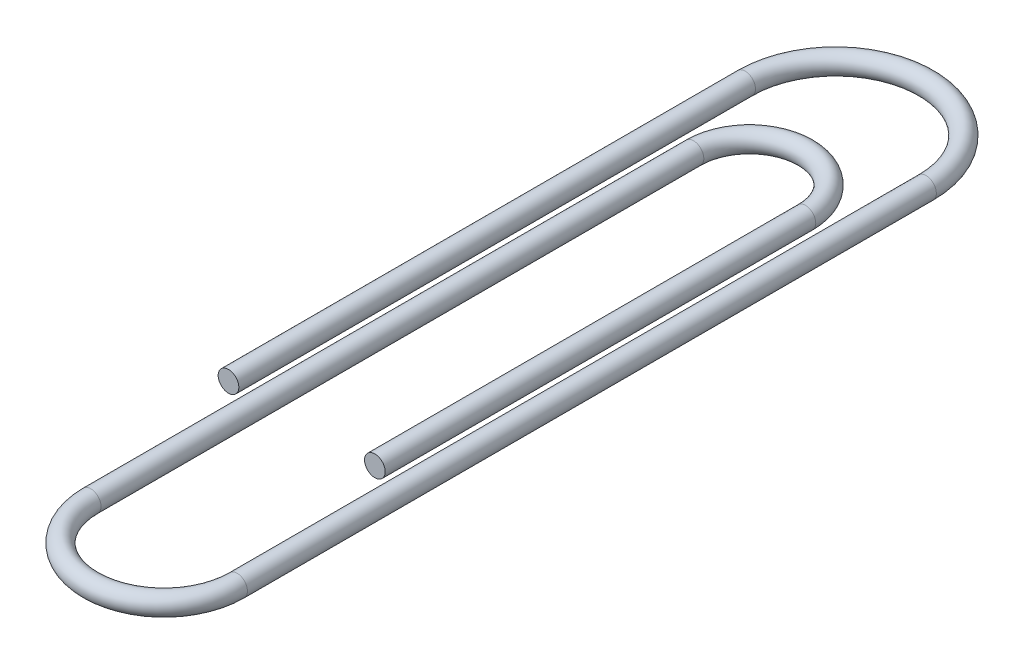
ISO-10303-21;
HEADER;
FILE_DESCRIPTION(('STEP AP214'),'2;1');
FILE_NAME('part.step','',(''),(''),'','','');
FILE_SCHEMA(('AUTOMOTIVE_DESIGN { 1 0 10303 214 1 1 1 1 }'));
ENDSEC;
DATA;
#1=APPLICATION_CONTEXT('core data for automotive mechanical design processes');
#2=APPLICATION_PROTOCOL_DEFINITION('international standard','automotive_design',2000,#1);
#3=PRODUCT_CONTEXT('',#1,'mechanical');
#4=PRODUCT('Part','Part','',(#3));
#5=PRODUCT_RELATED_PRODUCT_CATEGORY('part','',(#4));
#6=PRODUCT_DEFINITION_FORMATION('','',#4);
#7=PRODUCT_DEFINITION_CONTEXT('part definition',#1,'design');
#8=PRODUCT_DEFINITION('design','',#6,#7);
#9=PRODUCT_DEFINITION_SHAPE('','',#8);
#10=(LENGTH_UNIT() NAMED_UNIT(*) SI_UNIT(.MILLI.,.METRE.));
#11=(NAMED_UNIT(*) PLANE_ANGLE_UNIT() SI_UNIT($,.RADIAN.));
#12=(NAMED_UNIT(*) SI_UNIT($,.STERADIAN.) SOLID_ANGLE_UNIT());
#13=UNCERTAINTY_MEASURE_WITH_UNIT(LENGTH_MEASURE(1.E-05),#10,'distance_accuracy_value','');
#14=(GEOMETRIC_REPRESENTATION_CONTEXT(3) GLOBAL_UNCERTAINTY_ASSIGNED_CONTEXT((#13)) GLOBAL_UNIT_ASSIGNED_CONTEXT((#10,
#11,#12)) REPRESENTATION_CONTEXT('',''));
#15=CARTESIAN_POINT('',(0.,0.,0.));
#16=DIRECTION('',(0.,0.,1.));
#17=DIRECTION('',(1.,0.,0.));
#18=AXIS2_PLACEMENT_3D('',#15,#16,#17);
#19=CARTESIAN_POINT('',(0.,0.,0.));
#20=DIRECTION('',(0.,0.,1.));
#21=DIRECTION('',(1.,0.,0.));
#22=AXIS2_PLACEMENT_3D('',#19,#20,#21);
#23=PLANE('',#22);
#24=CARTESIAN_POINT('',(0.,0.,0.));
#25=DIRECTION('',(0.,0.,1.));
#26=DIRECTION('',(1.,0.,0.));
#27=AXIS2_PLACEMENT_3D('',#24,#25,#26);
#28=CIRCLE('',#27,0.6);
#29=CARTESIAN_POINT('',(0.6,0.,0.));
#30=VERTEX_POINT('',#29);
#31=EDGE_CURVE('E81',#30,#30,#28,.T.);
#32=ORIENTED_EDGE('',*,*,#31,.T.);
#33=EDGE_LOOP('',(#32));
#34=FACE_BOUND('',#33,.T.);
#35=ADVANCED_FACE('F53',(#34),#23,.T.);
#36=CARTESIAN_POINT('',(-8.49999999999999,0.,0.));
#37=DIRECTION('',(0.,0.,-1.));
#38=DIRECTION('',(-1.,0.,0.));
#39=AXIS2_PLACEMENT_3D('',#36,#37,#38);
#40=PLANE('',#39);
#41=CARTESIAN_POINT('',(-8.49999999999999,0.,0.));
#42=DIRECTION('',(0.,0.,-1.));
#43=DIRECTION('',(-1.,0.,0.));
#44=AXIS2_PLACEMENT_3D('',#41,#42,#43);
#45=CIRCLE('',#44,0.6);
#46=CARTESIAN_POINT('',(-9.09999999999999,0.,0.));
#47=VERTEX_POINT('',#46);
#48=EDGE_CURVE('E11',#47,#47,#45,.T.);
#49=ORIENTED_EDGE('',*,*,#48,.F.);
#50=EDGE_LOOP('',(#49));
#51=FACE_BOUND('',#50,.T.);
#52=ADVANCED_FACE('F89',(#51),#40,.F.);
#53=CARTESIAN_POINT('',(0.,0.,0.));
#54=DIRECTION('',(0.,0.,-1.));
#55=DIRECTION('',(-1.,0.,0.));
#56=AXIS2_PLACEMENT_3D('',#53,#54,#55);
#57=CYLINDRICAL_SURFACE('',#56,0.6);
#58=CARTESIAN_POINT('',(0.,0.,-25.));
#59=DIRECTION('',(0.,0.,1.));
#60=DIRECTION('',(1.,0.,0.));
#61=AXIS2_PLACEMENT_3D('',#58,#59,#60);
#62=CIRCLE('',#61,0.6);
#63=CARTESIAN_POINT('',(0.599999999999998,0.,-25.));
#64=VERTEX_POINT('',#63);
#65=EDGE_CURVE('E78',#64,#64,#62,.T.);
#66=ORIENTED_EDGE('',*,*,#65,.T.);
#67=EDGE_LOOP('',(#66));
#68=FACE_BOUND('',#67,.T.);
#69=ORIENTED_EDGE('',*,*,#31,.F.);
#70=EDGE_LOOP('',(#69));
#71=FACE_BOUND('',#70,.T.);
#72=ADVANCED_FACE('F86',(#68,#71),#57,.T.);
#73=CARTESIAN_POINT('',(-3.25,0.,-25.));
#74=DIRECTION('',(0.,1.,0.));
#75=DIRECTION('',(0.,0.,1.));
#76=AXIS2_PLACEMENT_3D('',#73,#74,#75);
#77=TOROIDAL_SURFACE('',#76,3.25,0.6);
#78=CARTESIAN_POINT('',(-6.5,0.,-25.));
#79=DIRECTION('',(0.,0.,-1.));
#80=DIRECTION('',(-1.,0.,0.));
#81=AXIS2_PLACEMENT_3D('',#78,#79,#80);
#82=CIRCLE('',#81,0.6);
#83=CARTESIAN_POINT('',(-7.1,0.,-25.));
#84=VERTEX_POINT('',#83);
#85=EDGE_CURVE('E75',#84,#84,#82,.T.);
#86=CARTESIAN_POINT('',(-3.25,0.,-25.));
#87=DIRECTION('',(0.,1.,0.));
#88=DIRECTION('',(0.,0.,1.));
#89=AXIS2_PLACEMENT_3D('',#86,#87,#88);
#90=CIRCLE('',#89,3.85);
#91=EDGE_CURVE('',#64,#84,#90,.T.);
#92=ORIENTED_EDGE('',*,*,#65,.F.);
#93=ORIENTED_EDGE('',*,*,#85,.T.);
#94=ORIENTED_EDGE('',*,*,#91,.T.);
#95=ORIENTED_EDGE('',*,*,#91,.F.);
#96=EDGE_LOOP('',(#92,#94,#93,#95));
#97=FACE_BOUND('',#96,.T.);
#98=ADVANCED_FACE('F88',(#97),#77,.T.);
#99=CARTESIAN_POINT('',(-6.5,0.,-25.));
#100=DIRECTION('',(0.,0.,1.));
#101=DIRECTION('',(1.,0.,0.));
#102=AXIS2_PLACEMENT_3D('',#99,#100,#101);
#103=CYLINDRICAL_SURFACE('',#102,0.6);
#104=CARTESIAN_POINT('',(-6.5,0.,10.));
#105=DIRECTION('',(0.,0.,-1.));
#106=DIRECTION('',(-1.,0.,0.));
#107=AXIS2_PLACEMENT_3D('',#104,#105,#106);
#108=CIRCLE('',#107,0.6);
#109=CARTESIAN_POINT('',(-7.1,0.,10.));
#110=VERTEX_POINT('',#109);
#111=EDGE_CURVE('E72',#110,#110,#108,.T.);
#112=ORIENTED_EDGE('',*,*,#111,.T.);
#113=EDGE_LOOP('',(#112));
#114=FACE_BOUND('',#113,.T.);
#115=ORIENTED_EDGE('',*,*,#85,.F.);
#116=EDGE_LOOP('',(#115));
#117=FACE_BOUND('',#116,.T.);
#118=ADVANCED_FACE('F96',(#114,#117),#103,.T.);
#119=CARTESIAN_POINT('',(-2.25,0.,10.));
#120=DIRECTION('',(0.,1.,0.));
#121=DIRECTION('',(0.,0.,1.));
#122=AXIS2_PLACEMENT_3D('',#119,#120,#121);
#123=TOROIDAL_SURFACE('',#122,4.25,0.6);
#124=CARTESIAN_POINT('',(2.,0.,10.));
#125=DIRECTION('',(0.,0.,1.));
#126=DIRECTION('',(1.,0.,0.));
#127=AXIS2_PLACEMENT_3D('',#124,#125,#126);
#128=CIRCLE('',#127,0.6);
#129=CARTESIAN_POINT('',(2.6,0.,10.));
#130=VERTEX_POINT('',#129);
#131=EDGE_CURVE('E67',#130,#130,#128,.T.);
#132=CARTESIAN_POINT('',(-2.25,0.,10.));
#133=DIRECTION('',(0.,1.,0.));
#134=DIRECTION('',(0.,0.,1.));
#135=AXIS2_PLACEMENT_3D('',#132,#133,#134);
#136=CIRCLE('',#135,4.85);
#137=EDGE_CURVE('',#110,#130,#136,.T.);
#138=ORIENTED_EDGE('',*,*,#111,.F.);
#139=ORIENTED_EDGE('',*,*,#131,.T.);
#140=ORIENTED_EDGE('',*,*,#137,.T.);
#141=ORIENTED_EDGE('',*,*,#137,.F.);
#142=EDGE_LOOP('',(#138,#140,#139,#141));
#143=FACE_BOUND('',#142,.T.);
#144=ADVANCED_FACE('F113',(#143),#123,.T.);
#145=CARTESIAN_POINT('',(2.00000000000001,0.,10.));
#146=DIRECTION('',(0.,0.,-1.));
#147=DIRECTION('',(-1.,0.,0.));
#148=AXIS2_PLACEMENT_3D('',#145,#146,#147);
#149=CYLINDRICAL_SURFACE('',#148,0.6);
#150=CARTESIAN_POINT('',(2.00000000000001,0.,-30.));
#151=DIRECTION('',(0.,0.,1.));
#152=DIRECTION('',(1.,0.,0.));
#153=AXIS2_PLACEMENT_3D('',#150,#151,#152);
#154=CIRCLE('',#153,0.6);
#155=CARTESIAN_POINT('',(2.6,0.,-30.));
#156=VERTEX_POINT('',#155);
#157=EDGE_CURVE('E63',#156,#156,#154,.T.);
#158=ORIENTED_EDGE('',*,*,#157,.T.);
#159=EDGE_LOOP('',(#158));
#160=FACE_BOUND('',#159,.T.);
#161=ORIENTED_EDGE('',*,*,#131,.F.);
#162=EDGE_LOOP('',(#161));
#163=FACE_BOUND('',#162,.T.);
#164=ADVANCED_FACE('F107',(#160,#163),#149,.T.);
#165=CARTESIAN_POINT('',(-3.25,0.,-30.));
#166=DIRECTION('',(0.,1.,0.));
#167=DIRECTION('',(0.,0.,1.));
#168=AXIS2_PLACEMENT_3D('',#165,#166,#167);
#169=TOROIDAL_SURFACE('',#168,5.25,0.6);
#170=CARTESIAN_POINT('',(-8.5,0.,-30.));
#171=DIRECTION('',(0.,0.,-1.));
#172=DIRECTION('',(-1.,0.,0.));
#173=AXIS2_PLACEMENT_3D('',#170,#171,#172);
#174=CIRCLE('',#173,0.6);
#175=CARTESIAN_POINT('',(-9.1,0.,-30.));
#176=VERTEX_POINT('',#175);
#177=EDGE_CURVE('E59',#176,#176,#174,.T.);
#178=CARTESIAN_POINT('',(-3.25,0.,-30.));
#179=DIRECTION('',(0.,1.,0.));
#180=DIRECTION('',(0.,0.,1.));
#181=AXIS2_PLACEMENT_3D('',#178,#179,#180);
#182=CIRCLE('',#181,5.85);
#183=EDGE_CURVE('',#156,#176,#182,.T.);
#184=ORIENTED_EDGE('',*,*,#157,.F.);
#185=ORIENTED_EDGE('',*,*,#177,.T.);
#186=ORIENTED_EDGE('',*,*,#183,.T.);
#187=ORIENTED_EDGE('',*,*,#183,.F.);
#188=EDGE_LOOP('',(#184,#186,#185,#187));
#189=FACE_BOUND('',#188,.T.);
#190=ADVANCED_FACE('F102',(#189),#169,.T.);
#191=CARTESIAN_POINT('',(-8.49999999999999,0.,-30.));
#192=DIRECTION('',(0.,0.,1.));
#193=DIRECTION('',(1.,0.,0.));
#194=AXIS2_PLACEMENT_3D('',#191,#192,#193);
#195=CYLINDRICAL_SURFACE('',#194,0.6);
#196=ORIENTED_EDGE('',*,*,#48,.T.);
#197=EDGE_LOOP('',(#196));
#198=FACE_BOUND('',#197,.T.);
#199=ORIENTED_EDGE('',*,*,#177,.F.);
#200=EDGE_LOOP('',(#199));
#201=FACE_BOUND('',#200,.T.);
#202=ADVANCED_FACE('F100',(#198,#201),#195,.T.);
#203=CLOSED_SHELL('',(#35,#52,#72,#98,#118,#144,#164,#190,#202));
#204=MANIFOLD_SOLID_BREP('B2',#203);
#205=ADVANCED_BREP_SHAPE_REPRESENTATION('',(#18,#204),#14);
#206=SHAPE_DEFINITION_REPRESENTATION(#9,#205);
ENDSEC;
END-ISO-10303-21;
